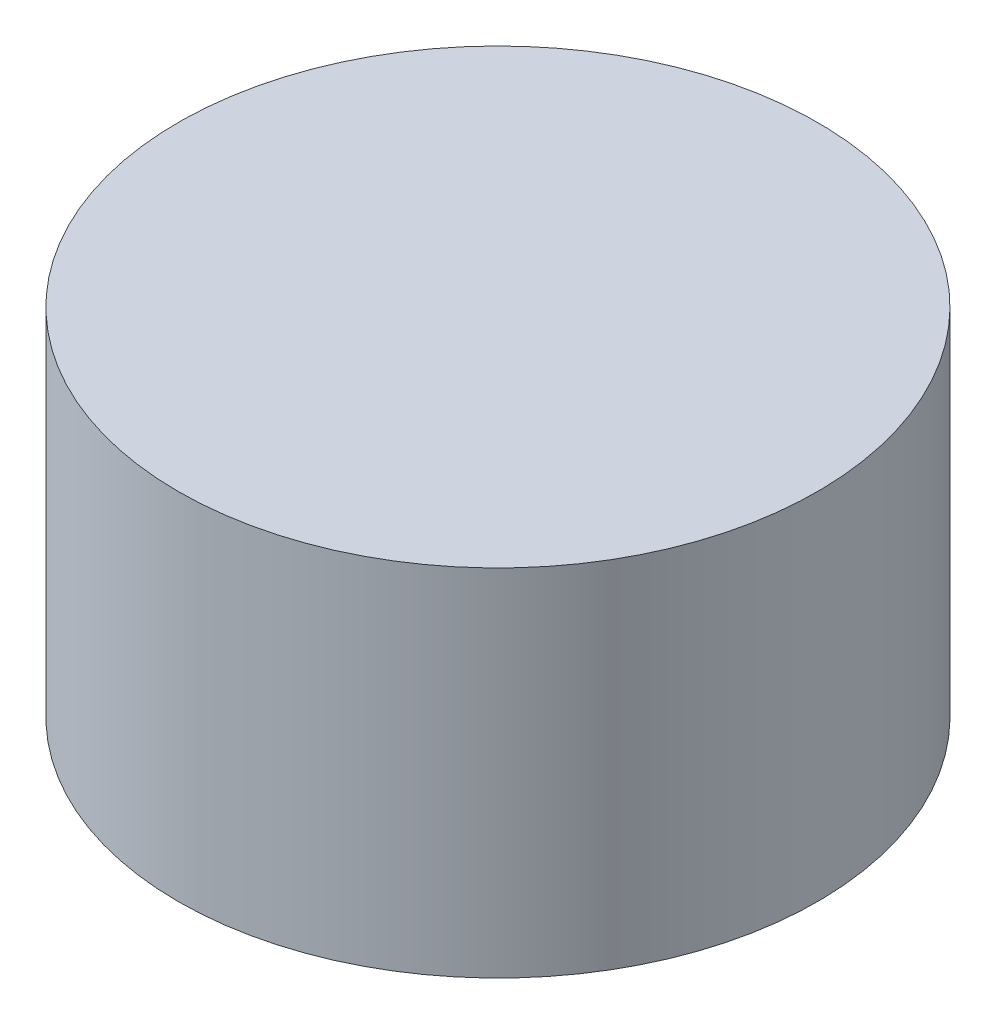
ISO-10303-21;
HEADER;
FILE_DESCRIPTION(('STEP AP214'),'2;1');
FILE_NAME('part.step','',(''),(''),'','','');
FILE_SCHEMA(('AUTOMOTIVE_DESIGN { 1 0 10303 214 1 1 1 1 }'));
ENDSEC;
DATA;
#1=APPLICATION_CONTEXT('core data for automotive mechanical design processes');
#2=APPLICATION_PROTOCOL_DEFINITION('international standard','automotive_design',2000,#1);
#3=PRODUCT_CONTEXT('',#1,'mechanical');
#4=PRODUCT('Part','Part','',(#3));
#5=PRODUCT_RELATED_PRODUCT_CATEGORY('part','',(#4));
#6=PRODUCT_DEFINITION_FORMATION('','',#4);
#7=PRODUCT_DEFINITION_CONTEXT('part definition',#1,'design');
#8=PRODUCT_DEFINITION('design','',#6,#7);
#9=PRODUCT_DEFINITION_SHAPE('','',#8);
#10=(LENGTH_UNIT() NAMED_UNIT(*) SI_UNIT(.MILLI.,.METRE.));
#11=(NAMED_UNIT(*) PLANE_ANGLE_UNIT() SI_UNIT($,.RADIAN.));
#12=(NAMED_UNIT(*) SI_UNIT($,.STERADIAN.) SOLID_ANGLE_UNIT());
#13=UNCERTAINTY_MEASURE_WITH_UNIT(LENGTH_MEASURE(1.E-05),#10,'distance_accuracy_value','');
#14=(GEOMETRIC_REPRESENTATION_CONTEXT(3) GLOBAL_UNCERTAINTY_ASSIGNED_CONTEXT((#13)) GLOBAL_UNIT_ASSIGNED_CONTEXT((#10,
#11,#12)) REPRESENTATION_CONTEXT('',''));
#15=CARTESIAN_POINT('',(0.,0.,0.));
#16=DIRECTION('',(0.,0.,1.));
#17=DIRECTION('',(1.,0.,0.));
#18=AXIS2_PLACEMENT_3D('',#15,#16,#17);
#19=CARTESIAN_POINT('',(0.,100.,0.));
#20=DIRECTION('',(0.,-1.,0.));
#21=DIRECTION('',(0.,0.,-1.));
#22=AXIS2_PLACEMENT_3D('',#19,#20,#21);
#23=CYLINDRICAL_SURFACE('',#22,90.);
#24=CARTESIAN_POINT('',(0.,100.,0.));
#25=DIRECTION('',(0.,1.,0.));
#26=DIRECTION('',(0.,0.,1.));
#27=AXIS2_PLACEMENT_3D('',#24,#25,#26);
#28=CIRCLE('',#27,90.);
#29=CARTESIAN_POINT('',(0.,100.,90.));
#30=VERTEX_POINT('',#29);
#31=EDGE_CURVE('E10',#30,#30,#28,.T.);
#32=ORIENTED_EDGE('',*,*,#31,.F.);
#33=EDGE_LOOP('',(#32));
#34=FACE_BOUND('',#33,.T.);
#35=CARTESIAN_POINT('',(0.,0.,0.));
#36=DIRECTION('',(0.,1.,0.));
#37=DIRECTION('',(0.,0.,1.));
#38=AXIS2_PLACEMENT_3D('',#35,#36,#37);
#39=CIRCLE('',#38,90.);
#40=CARTESIAN_POINT('',(0.,0.,90.));
#41=VERTEX_POINT('',#40);
#42=EDGE_CURVE('E38',#41,#41,#39,.T.);
#43=ORIENTED_EDGE('',*,*,#42,.T.);
#44=EDGE_LOOP('',(#43));
#45=FACE_BOUND('',#44,.T.);
#46=ADVANCED_FACE('F35',(#34,#45),#23,.T.);
#47=CARTESIAN_POINT('',(0.,100.,0.));
#48=DIRECTION('',(0.,1.,0.));
#49=DIRECTION('',(0.,0.,1.));
#50=AXIS2_PLACEMENT_3D('',#47,#48,#49);
#51=PLANE('',#50);
#52=ORIENTED_EDGE('',*,*,#31,.T.);
#53=EDGE_LOOP('',(#52));
#54=FACE_BOUND('',#53,.T.);
#55=ADVANCED_FACE('F50',(#54),#51,.T.);
#56=CARTESIAN_POINT('',(0.,0.,0.));
#57=DIRECTION('',(0.,1.,0.));
#58=DIRECTION('',(0.,0.,1.));
#59=AXIS2_PLACEMENT_3D('',#56,#57,#58);
#60=PLANE('',#59);
#61=ORIENTED_EDGE('',*,*,#42,.F.);
#62=EDGE_LOOP('',(#61));
#63=FACE_BOUND('',#62,.T.);
#64=ADVANCED_FACE('F48',(#63),#60,.F.);
#65=CLOSED_SHELL('',(#46,#55,#64));
#66=MANIFOLD_SOLID_BREP('B2',#65);
#67=ADVANCED_BREP_SHAPE_REPRESENTATION('',(#18,#66),#14);
#68=SHAPE_DEFINITION_REPRESENTATION(#9,#67);
ENDSEC;
END-ISO-10303-21;
